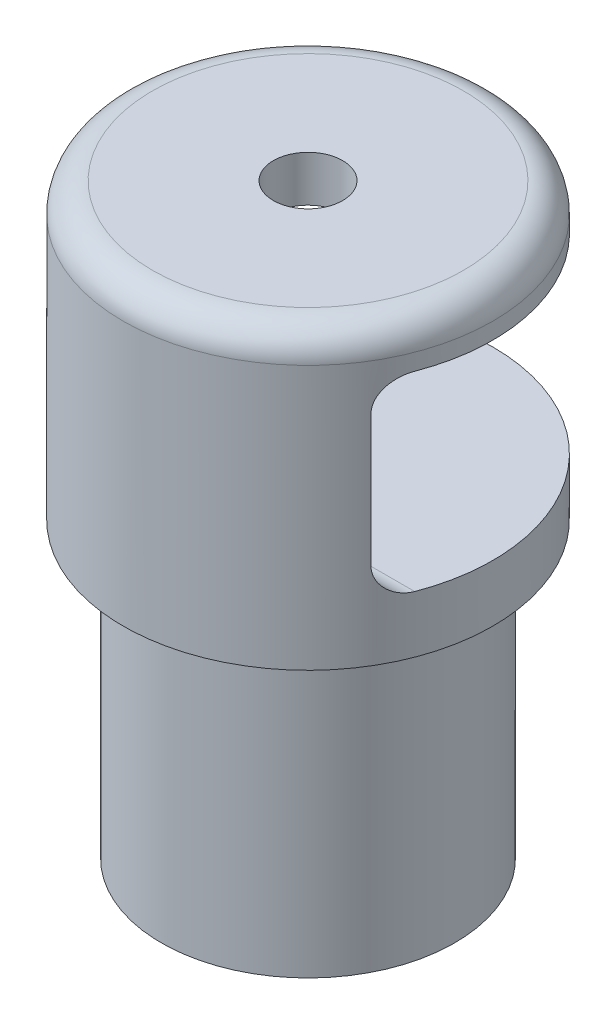
ISO-10303-21;
HEADER;
FILE_DESCRIPTION(('STEP AP214'),'2;1');
FILE_NAME('part.step','',(''),(''),'','','');
FILE_SCHEMA(('AUTOMOTIVE_DESIGN { 1 0 10303 214 1 1 1 1 }'));
ENDSEC;
DATA;
#1=APPLICATION_CONTEXT('core data for automotive mechanical design processes');
#2=APPLICATION_PROTOCOL_DEFINITION('international standard','automotive_design',2000,#1);
#3=PRODUCT_CONTEXT('',#1,'mechanical');
#4=PRODUCT('Part','Part','',(#3));
#5=PRODUCT_RELATED_PRODUCT_CATEGORY('part','',(#4));
#6=PRODUCT_DEFINITION_FORMATION('','',#4);
#7=PRODUCT_DEFINITION_CONTEXT('part definition',#1,'design');
#8=PRODUCT_DEFINITION('design','',#6,#7);
#9=PRODUCT_DEFINITION_SHAPE('','',#8);
#10=(LENGTH_UNIT() NAMED_UNIT(*) SI_UNIT(.MILLI.,.METRE.));
#11=(NAMED_UNIT(*) PLANE_ANGLE_UNIT() SI_UNIT($,.RADIAN.));
#12=(NAMED_UNIT(*) SI_UNIT($,.STERADIAN.) SOLID_ANGLE_UNIT());
#13=UNCERTAINTY_MEASURE_WITH_UNIT(LENGTH_MEASURE(1.E-05),#10,'distance_accuracy_value','');
#14=(GEOMETRIC_REPRESENTATION_CONTEXT(3) GLOBAL_UNCERTAINTY_ASSIGNED_CONTEXT((#13)) GLOBAL_UNIT_ASSIGNED_CONTEXT((#10,
#11,#12)) REPRESENTATION_CONTEXT('',''));
#15=CARTESIAN_POINT('',(0.,0.,0.));
#16=DIRECTION('',(0.,0.,1.));
#17=DIRECTION('',(1.,0.,0.));
#18=AXIS2_PLACEMENT_3D('',#15,#16,#17);
#19=CARTESIAN_POINT('',(0.,25.4,0.));
#20=DIRECTION('',(0.,-1.,0.));
#21=DIRECTION('',(0.,0.,-1.));
#22=AXIS2_PLACEMENT_3D('',#19,#20,#21);
#23=CYLINDRICAL_SURFACE('',#22,8.001);
#24=CARTESIAN_POINT('',(0.,24.13,0.));
#25=DIRECTION('',(0.,1.,0.));
#26=DIRECTION('',(0.,0.,1.));
#27=AXIS2_PLACEMENT_3D('',#24,#25,#26);
#28=CIRCLE('',#27,8.001);
#29=CARTESIAN_POINT('',(0.,24.13,8.001));
#30=VERTEX_POINT('',#29);
#31=EDGE_CURVE('E12',#30,#30,#28,.F.);
#32=ORIENTED_EDGE('',*,*,#31,.T.);
#33=EDGE_LOOP('',(#32));
#34=FACE_BOUND('',#33,.T.);
#35=CARTESIAN_POINT('',(0.,12.7,0.));
#36=DIRECTION('',(0.,-1.,0.));
#37=DIRECTION('',(0.,0.,-1.));
#38=AXIS2_PLACEMENT_3D('',#35,#36,#37);
#39=CIRCLE('',#38,8.001);
#40=CARTESIAN_POINT('',(0.,12.7,-8.001));
#41=VERTEX_POINT('',#40);
#42=EDGE_CURVE('E166',#41,#41,#39,.T.);
#43=ORIENTED_EDGE('',*,*,#42,.F.);
#44=EDGE_LOOP('',(#43));
#45=FACE_BOUND('',#44,.T.);
#46=DIRECTION('',(0.,-1.,0.));
#47=VECTOR('',#46,1.);
#48=CARTESIAN_POINT('',(6.85417717527057,25.4,4.1275));
#49=LINE('',#48,#47);
#50=CARTESIAN_POINT('',(6.85417717527057,22.1474266458921,4.1275));
#51=VERTEX_POINT('',#50);
#52=CARTESIAN_POINT('',(6.85417717527057,16.4324266458921,4.1275));
#53=VERTEX_POINT('',#52);
#54=EDGE_CURVE('E98',#51,#53,#49,.T.);
#55=ORIENTED_EDGE('',*,*,#54,.F.);
#56=CARTESIAN_POINT('',(6.85417717527057,22.1474266458921,4.1275));
#57=CARTESIAN_POINT('',(6.85417429884556,22.1798470518382,4.12750225335564));
#58=CARTESIAN_POINT('',(6.85492544327897,22.2122498815022,4.12625765111741));
#59=CARTESIAN_POINT('',(6.85790245854433,22.2767847183524,4.12130895610945));
#60=CARTESIAN_POINT('',(6.86012766901702,22.3089168402868,4.11760596465921));
#61=CARTESIAN_POINT('',(6.86893039923192,22.4042175790299,4.10291757081671));
#62=CARTESIAN_POINT('',(6.87763587088217,22.4666819283525,4.08835180226247));
#63=CARTESIAN_POINT('',(6.90004653430044,22.5877570395317,4.05041171354695));
#64=CARTESIAN_POINT('',(6.91374485232608,22.6463729692713,4.02704950215496));
#65=CARTESIAN_POINT('',(6.94524716607248,22.7586881959465,3.97247199781805));
#66=CARTESIAN_POINT('',(6.96305585155181,22.812381778164,3.9412477308657));
#67=CARTESIAN_POINT('',(7.00310213003201,22.9173040559657,3.86967037365722));
#68=CARTESIAN_POINT('',(7.02555646335208,22.9681268256126,3.8288459469888));
#69=CARTESIAN_POINT('',(7.07291797679626,23.0623834477106,3.74063372286644));
#70=CARTESIAN_POINT('',(7.0978261508631,23.1058142864264,3.6932432626169));
#71=CARTESIAN_POINT('',(7.15248233258746,23.1899528944106,3.58636967472194));
#72=CARTESIAN_POINT('',(7.18243592710045,23.2295504654812,3.52611587806907));
#73=CARTESIAN_POINT('',(7.24296524524495,23.2979406731036,3.40005225596353));
#74=CARTESIAN_POINT('',(7.2735410564545,23.3267317773822,3.33424164421687));
#75=CARTESIAN_POINT('',(7.33309185839614,23.3720136838401,3.20106934192217));
#76=CARTESIAN_POINT('',(7.36208385701293,23.3889256348783,3.13385860300669));
#77=CARTESIAN_POINT('',(7.41883513522172,23.4116397455985,2.99708241498394));
#78=CARTESIAN_POINT('',(7.44659431797212,23.417441034005,2.92751678164597));
#79=CARTESIAN_POINT('',(7.47333223870048,23.4174266458921,2.8575));
#80=B_SPLINE_CURVE_WITH_KNOTS('',3,(#56,#57,#58,#59,#60,#61,#62,#63,#64,#65,#66,#67,#68,#69,#70,
#71,#72,#73,#74,#75,#76,#77,#78,#79),.UNSPECIFIED.,.F.,.F.,(4,2,2,2,2,2,2,2,2,2,2,4),(0.,
0.0971947560388502,0.194345999718748,0.387490892143032,0.58037087669125,0.773472026782988,
0.979505916531334,1.18562360737006,1.41886176494324,1.65213298139756,1.87664789978313,
2.10118042344629),.UNSPECIFIED.);
#81=CARTESIAN_POINT('',(7.47333223870048,23.4174266458921,2.8575));
#82=VERTEX_POINT('',#81);
#83=EDGE_CURVE('E90',#51,#82,#80,.T.);
#84=ORIENTED_EDGE('',*,*,#83,.T.);
#85=CARTESIAN_POINT('',(0.,23.4174266458921,0.));
#86=DIRECTION('',(0.,-1.,0.));
#87=DIRECTION('',(0.,0.,-1.));
#88=AXIS2_PLACEMENT_3D('',#85,#86,#87);
#89=CIRCLE('',#88,8.001);
#90=CARTESIAN_POINT('',(-7.47333223870048,23.4174266458921,2.8575));
#91=VERTEX_POINT('',#90);
#92=EDGE_CURVE('E96',#91,#82,#89,.T.);
#93=ORIENTED_EDGE('',*,*,#92,.F.);
#94=CARTESIAN_POINT('',(-7.47333223870048,23.4174266458921,2.8575));
#95=CARTESIAN_POINT('',(-7.45847541982357,23.417425099579,2.89636075325786));
#96=CARTESIAN_POINT('',(-7.44332044203771,23.4156424137241,2.93508137181429));
#97=CARTESIAN_POINT('',(-7.41252836035214,23.408586073515,3.01199861443586));
#98=CARTESIAN_POINT('',(-7.3968913807876,23.403313312379,3.05019537002129));
#99=CARTESIAN_POINT('',(-7.34946348100169,23.3823859558764,3.16355307239509));
#100=CARTESIAN_POINT('',(-7.31711129396058,23.3616218518537,3.23759701562488));
#101=CARTESIAN_POINT('',(-7.25216394423312,23.3072317082288,3.38057667640805));
#102=CARTESIAN_POINT('',(-7.21956891180543,23.2736121367251,3.44951494204385));
#103=CARTESIAN_POINT('',(-7.15543871669103,23.1942465155436,3.58064577300952));
#104=CARTESIAN_POINT('',(-7.12390395435678,23.148495941941,3.64283580955418));
#105=CARTESIAN_POINT('',(-7.06334516474173,23.0454255784023,3.75891848185676));
#106=CARTESIAN_POINT('',(-7.03433481718968,22.9880477608441,3.81276701063749));
#107=CARTESIAN_POINT('',(-6.98090677503764,22.8629364810847,3.90973304640347));
#108=CARTESIAN_POINT('',(-6.95648708960734,22.7952075310648,3.95285520772174));
#109=CARTESIAN_POINT('',(-6.91625333256087,22.6576987355831,4.02280087955988));
#110=CARTESIAN_POINT('',(-6.89985946330156,22.588662616309,4.05074825189861));
#111=CARTESIAN_POINT('',(-6.87414537454121,22.4456289353831,4.0942376055976));
#112=CARTESIAN_POINT('',(-6.86480411962507,22.3716468501086,4.10981648495452));
#113=CARTESIAN_POINT('',(-6.85771095383446,22.2719728150129,4.12162673383259));
#114=CARTESIAN_POINT('',(-6.85638717132993,22.2471205230893,4.12382807078718));
#115=CARTESIAN_POINT('',(-6.8546212376712,22.1973258896554,4.12676296592364));
#116=CARTESIAN_POINT('',(-6.85417811148885,22.1723836783983,4.12749814737854));
#117=CARTESIAN_POINT('',(-6.85417717527057,22.1474266458921,4.1275));
#118=B_SPLINE_CURVE_WITH_KNOTS('',3,(#94,#95,#96,#97,#98,#99,#100,#101,#102,#103,#104,#105,#106,
#107,#108,#109,#110,#111,#112,#113,#114,#115,#116,#117),.UNSPECIFIED.,.F.,.F.,(4,2,2,2,2,2,2,2,
2,2,2,4),(0.,0.124726496325903,0.249421083625277,0.498443755433588,0.747341298514928,
0.996331791979455,1.24659694985154,1.49675332370686,1.72421112118749,1.95098778405803,
2.02589775101828,2.10072473429288),.UNSPECIFIED.);
#119=CARTESIAN_POINT('',(-6.85417717527057,22.1474266458921,4.1275));
#120=VERTEX_POINT('',#119);
#121=EDGE_CURVE('E82',#91,#120,#118,.T.);
#122=ORIENTED_EDGE('',*,*,#121,.T.);
#123=DIRECTION('',(0.,-1.,0.));
#124=VECTOR('',#123,1.);
#125=CARTESIAN_POINT('',(-6.85417717527057,25.4,4.1275));
#126=LINE('',#125,#124);
#127=CARTESIAN_POINT('',(-6.85417717527057,16.4324266458921,4.1275));
#128=VERTEX_POINT('',#127);
#129=EDGE_CURVE('E102',#128,#120,#126,.F.);
#130=ORIENTED_EDGE('',*,*,#129,.F.);
#131=CARTESIAN_POINT('',(-6.85417717527057,16.4324266458921,4.1275));
#132=CARTESIAN_POINT('',(-6.85417429884556,16.4000062399459,4.12750225335564));
#133=CARTESIAN_POINT('',(-6.85492544327897,16.3676034102819,4.12625765111742));
#134=CARTESIAN_POINT('',(-6.85790245854433,16.3030685734318,4.12130895610945));
#135=CARTESIAN_POINT('',(-6.86012766901702,16.2709364514974,4.11760596465921));
#136=CARTESIAN_POINT('',(-6.86893039923192,16.1756357127543,4.10291757081671));
#137=CARTESIAN_POINT('',(-6.87763587088217,16.1131713634317,4.08835180226247));
#138=CARTESIAN_POINT('',(-6.90004653430044,15.9920962522525,4.05041171354695));
#139=CARTESIAN_POINT('',(-6.91374485232608,15.9334803225128,4.02704950215496));
#140=CARTESIAN_POINT('',(-6.94524716607248,15.8211650958376,3.97247199781805));
#141=CARTESIAN_POINT('',(-6.96305585155181,15.7674715136201,3.9412477308657));
#142=CARTESIAN_POINT('',(-7.00310213003201,15.6625492358185,3.86967037365722));
#143=CARTESIAN_POINT('',(-7.02555646335208,15.6117264661715,3.8288459469888));
#144=CARTESIAN_POINT('',(-7.07291797679626,15.5174698440735,3.74063372286644));
#145=CARTESIAN_POINT('',(-7.0978261508631,15.4740390053577,3.69324326261689));
#146=CARTESIAN_POINT('',(-7.15248233258746,15.3899003973735,3.58636967472194));
#147=CARTESIAN_POINT('',(-7.18243592710045,15.3503028263029,3.52611587806907));
#148=CARTESIAN_POINT('',(-7.24296524524495,15.2819126186805,3.40005225596353));
#149=CARTESIAN_POINT('',(-7.2735410564545,15.2531215144019,3.33424164421687));
#150=CARTESIAN_POINT('',(-7.33309185839614,15.2078396079441,3.20106934192217));
#151=CARTESIAN_POINT('',(-7.36208385701293,15.1909276569058,3.13385860300669));
#152=CARTESIAN_POINT('',(-7.41883513522172,15.1682135461857,2.99708241498394));
#153=CARTESIAN_POINT('',(-7.44659431797213,15.1624122577791,2.92751678164597));
#154=CARTESIAN_POINT('',(-7.47333223870048,15.1624266458921,2.8575));
#155=B_SPLINE_CURVE_WITH_KNOTS('',3,(#131,#132,#133,#134,#135,#136,#137,#138,#139,#140,#141,
#142,#143,#144,#145,#146,#147,#148,#149,#150,#151,#152,#153,#154),.UNSPECIFIED.,.F.,.F.,(4,2,2,
2,2,2,2,2,2,2,2,4),(0.,0.0971947560388537,0.194345999718748,0.387490892143032,0.580370876691254,
0.773472026782988,0.979505916531334,1.18562360737006,1.41886176494325,1.65213298139757,
1.87664789978313,2.10118042344629),.UNSPECIFIED.);
#156=CARTESIAN_POINT('',(-7.47333223870048,15.1624266458921,2.8575));
#157=VERTEX_POINT('',#156);
#158=EDGE_CURVE('E53',#128,#157,#155,.T.);
#159=ORIENTED_EDGE('',*,*,#158,.T.);
#160=CARTESIAN_POINT('',(0.,15.1624266458921,0.));
#161=DIRECTION('',(0.,1.,0.));
#162=DIRECTION('',(0.,0.,1.));
#163=AXIS2_PLACEMENT_3D('',#160,#161,#162);
#164=CIRCLE('',#163,8.001);
#165=CARTESIAN_POINT('',(7.47333223870048,15.1624266458921,2.8575));
#166=VERTEX_POINT('',#165);
#167=EDGE_CURVE('E101',#166,#157,#164,.T.);
#168=ORIENTED_EDGE('',*,*,#167,.F.);
#169=CARTESIAN_POINT('',(7.47333223870048,15.1624266458921,2.8575));
#170=CARTESIAN_POINT('',(7.45847541982357,15.1624281922052,2.89636075325786));
#171=CARTESIAN_POINT('',(7.4433204420377,15.1642108780601,2.93508137181428));
#172=CARTESIAN_POINT('',(7.41252836035214,15.1712672182691,3.01199861443586));
#173=CARTESIAN_POINT('',(7.3968913807876,15.1765399794051,3.05019537002129));
#174=CARTESIAN_POINT('',(7.34946348100169,15.1974673359078,3.1635530723951));
#175=CARTESIAN_POINT('',(7.31711129396058,15.2182314399304,3.23759701562488));
#176=CARTESIAN_POINT('',(7.25216394423312,15.2726215835553,3.38057667640805));
#177=CARTESIAN_POINT('',(7.21956891180543,15.306241155059,3.44951494204386));
#178=CARTESIAN_POINT('',(7.15543871669103,15.3856067762405,3.58064577300952));
#179=CARTESIAN_POINT('',(7.12390395435678,15.4313573498431,3.64283580955418));
#180=CARTESIAN_POINT('',(7.06334516474173,15.5344277133818,3.75891848185676));
#181=CARTESIAN_POINT('',(7.03433481718968,15.59180553094,3.81276701063749));
#182=CARTESIAN_POINT('',(6.98090677503764,15.7169168106994,3.90973304640347));
#183=CARTESIAN_POINT('',(6.95648708960734,15.7846457607194,3.95285520772175));
#184=CARTESIAN_POINT('',(6.91625333256087,15.922154556201,4.02280087955988));
#185=CARTESIAN_POINT('',(6.89985946330156,15.9911906754751,4.05074825189862));
#186=CARTESIAN_POINT('',(6.87414537454121,16.134224356401,4.0942376055976));
#187=CARTESIAN_POINT('',(6.86480411962507,16.2082064416756,4.10981648495452));
#188=CARTESIAN_POINT('',(6.85771095383446,16.3078804767713,4.12162673383259));
#189=CARTESIAN_POINT('',(6.85638717132993,16.3327327686949,4.12382807078718));
#190=CARTESIAN_POINT('',(6.8546212376712,16.3825274021287,4.12676296592364));
#191=CARTESIAN_POINT('',(6.85417811148885,16.4074696133859,4.12749814737854));
#192=CARTESIAN_POINT('',(6.85417717527057,16.4324266458921,4.1275));
#193=B_SPLINE_CURVE_WITH_KNOTS('',3,(#169,#170,#171,#172,#173,#174,#175,#176,#177,#178,#179,
#180,#181,#182,#183,#184,#185,#186,#187,#188,#189,#190,#191,#192),.UNSPECIFIED.,.F.,.F.,(4,2,2,
2,2,2,2,2,2,2,2,4),(0.,0.124726496325903,0.249421083625276,0.498443755433589,0.74734129851493,
0.996331791979456,1.24659694985154,1.49675332370686,1.72421112118749,1.95098778405803,
2.02589775101827,2.10072473429288),.UNSPECIFIED.);
#194=EDGE_CURVE('E61',#166,#53,#193,.T.);
#195=ORIENTED_EDGE('',*,*,#194,.T.);
#196=EDGE_LOOP('',(#55,#84,#93,#122,#130,#159,#168,#195));
#197=FACE_BOUND('',#196,.T.);
#198=ADVANCED_FACE('F38',(#34,#45,#197),#23,.T.);
#199=CARTESIAN_POINT('',(0.,0.,0.));
#200=DIRECTION('',(0.,1.,0.));
#201=DIRECTION('',(0.,0.,1.));
#202=AXIS2_PLACEMENT_3D('',#199,#200,#201);
#203=PLANE('',#202);
#204=CARTESIAN_POINT('',(0.,0.,0.));
#205=DIRECTION('',(0.,-1.,0.));
#206=DIRECTION('',(0.,0.,-1.));
#207=AXIS2_PLACEMENT_3D('',#204,#205,#206);
#208=CIRCLE('',#207,4.699);
#209=CARTESIAN_POINT('',(0.,0.,-4.699));
#210=VERTEX_POINT('',#209);
#211=EDGE_CURVE('E168',#210,#210,#208,.T.);
#212=ORIENTED_EDGE('',*,*,#211,.F.);
#213=EDGE_LOOP('',(#212));
#214=FACE_BOUND('',#213,.T.);
#215=CARTESIAN_POINT('',(0.,0.,0.));
#216=DIRECTION('',(0.,-1.,0.));
#217=DIRECTION('',(0.,0.,-1.));
#218=AXIS2_PLACEMENT_3D('',#215,#216,#217);
#219=CIRCLE('',#218,6.35);
#220=CARTESIAN_POINT('',(0.,0.,-6.35));
#221=VERTEX_POINT('',#220);
#222=EDGE_CURVE('E173',#221,#221,#219,.T.);
#223=ORIENTED_EDGE('',*,*,#222,.T.);
#224=EDGE_LOOP('',(#223));
#225=FACE_BOUND('',#224,.T.);
#226=ADVANCED_FACE('F156',(#214,#225),#203,.F.);
#227=CARTESIAN_POINT('',(0.,12.7,0.));
#228=DIRECTION('',(0.,-1.,0.));
#229=DIRECTION('',(0.,0.,-1.));
#230=AXIS2_PLACEMENT_3D('',#227,#228,#229);
#231=CYLINDRICAL_SURFACE('',#230,4.699);
#232=CARTESIAN_POINT('',(0.,12.7,0.));
#233=DIRECTION('',(0.,-1.,0.));
#234=DIRECTION('',(0.,0.,-1.));
#235=AXIS2_PLACEMENT_3D('',#232,#233,#234);
#236=CIRCLE('',#235,4.699);
#237=CARTESIAN_POINT('',(0.,12.7,-4.699));
#238=VERTEX_POINT('',#237);
#239=EDGE_CURVE('E105',#238,#238,#236,.T.);
#240=ORIENTED_EDGE('',*,*,#239,.F.);
#241=EDGE_LOOP('',(#240));
#242=FACE_BOUND('',#241,.T.);
#243=ORIENTED_EDGE('',*,*,#211,.T.);
#244=EDGE_LOOP('',(#243));
#245=FACE_BOUND('',#244,.T.);
#246=ADVANCED_FACE('F161',(#242,#245),#231,.F.);
#247=CARTESIAN_POINT('',(0.,12.7,0.));
#248=DIRECTION('',(0.,-1.,0.));
#249=DIRECTION('',(0.,0.,-1.));
#250=AXIS2_PLACEMENT_3D('',#247,#248,#249);
#251=PLANE('',#250);
#252=CARTESIAN_POINT('',(0.,12.7,0.));
#253=DIRECTION('',(0.,-1.,0.));
#254=DIRECTION('',(0.,0.,-1.));
#255=AXIS2_PLACEMENT_3D('',#252,#253,#254);
#256=CIRCLE('',#255,1.25);
#257=CARTESIAN_POINT('',(0.,12.7,-1.25));
#258=VERTEX_POINT('',#257);
#259=EDGE_CURVE('E238',#258,#258,#256,.F.);
#260=ORIENTED_EDGE('',*,*,#259,.T.);
#261=EDGE_LOOP('',(#260));
#262=FACE_BOUND('',#261,.T.);
#263=ORIENTED_EDGE('',*,*,#239,.T.);
#264=EDGE_LOOP('',(#263));
#265=FACE_BOUND('',#264,.T.);
#266=ADVANCED_FACE('F183',(#262,#265),#251,.T.);
#267=CARTESIAN_POINT('',(0.,12.7,0.));
#268=DIRECTION('',(0.,-1.,0.));
#269=DIRECTION('',(0.,0.,-1.));
#270=AXIS2_PLACEMENT_3D('',#267,#268,#269);
#271=CYLINDRICAL_SURFACE('',#270,6.35);
#272=CARTESIAN_POINT('',(0.,12.7,0.));
#273=DIRECTION('',(0.,-1.,0.));
#274=DIRECTION('',(0.,0.,-1.));
#275=AXIS2_PLACEMENT_3D('',#272,#273,#274);
#276=CIRCLE('',#275,6.35);
#277=CARTESIAN_POINT('',(0.,12.7,-6.35));
#278=VERTEX_POINT('',#277);
#279=EDGE_CURVE('E169',#278,#278,#276,.T.);
#280=ORIENTED_EDGE('',*,*,#279,.T.);
#281=EDGE_LOOP('',(#280));
#282=FACE_BOUND('',#281,.T.);
#283=ORIENTED_EDGE('',*,*,#222,.F.);
#284=EDGE_LOOP('',(#283));
#285=FACE_BOUND('',#284,.T.);
#286=ADVANCED_FACE('F192',(#282,#285),#271,.T.);
#287=CARTESIAN_POINT('',(0.,12.7,0.));
#288=DIRECTION('',(0.,-1.,0.));
#289=DIRECTION('',(0.,0.,-1.));
#290=AXIS2_PLACEMENT_3D('',#287,#288,#289);
#291=PLANE('',#290);
#292=ORIENTED_EDGE('',*,*,#279,.F.);
#293=EDGE_LOOP('',(#292));
#294=FACE_BOUND('',#293,.T.);
#295=ORIENTED_EDGE('',*,*,#42,.T.);
#296=EDGE_LOOP('',(#295));
#297=FACE_BOUND('',#296,.T.);
#298=ADVANCED_FACE('F194',(#294,#297),#291,.T.);
#299=CARTESIAN_POINT('',(0.,25.4,0.));
#300=DIRECTION('',(0.,1.,0.));
#301=DIRECTION('',(0.,0.,1.));
#302=AXIS2_PLACEMENT_3D('',#299,#300,#301);
#303=PLANE('',#302);
#304=CARTESIAN_POINT('',(0.,25.4,0.));
#305=DIRECTION('',(0.,1.,0.));
#306=DIRECTION('',(0.,0.,1.));
#307=AXIS2_PLACEMENT_3D('',#304,#305,#306);
#308=CIRCLE('',#307,6.731);
#309=CARTESIAN_POINT('',(0.,25.4,6.731));
#310=VERTEX_POINT('',#309);
#311=EDGE_CURVE('E46',#310,#310,#308,.T.);
#312=ORIENTED_EDGE('',*,*,#311,.T.);
#313=EDGE_LOOP('',(#312));
#314=FACE_BOUND('',#313,.T.);
#315=CARTESIAN_POINT('',(0.,25.4,0.));
#316=DIRECTION('',(0.,1.,0.));
#317=DIRECTION('',(0.,0.,1.));
#318=AXIS2_PLACEMENT_3D('',#315,#316,#317);
#319=CIRCLE('',#318,1.5);
#320=CARTESIAN_POINT('',(0.,25.4,1.5));
#321=VERTEX_POINT('',#320);
#322=EDGE_CURVE('E179',#321,#321,#319,.T.);
#323=ORIENTED_EDGE('',*,*,#322,.F.);
#324=EDGE_LOOP('',(#323));
#325=FACE_BOUND('',#324,.T.);
#326=ADVANCED_FACE('F143',(#314,#325),#303,.T.);
#327=CARTESIAN_POINT('',(-10.164689161229,15.1624266458921,4.1275));
#328=DIRECTION('',(0.,1.,0.));
#329=DIRECTION('',(0.,0.,1.));
#330=AXIS2_PLACEMENT_3D('',#327,#328,#329);
#331=PLANE('',#330);
#332=CARTESIAN_POINT('',(0.,15.1624266458921,0.));
#333=DIRECTION('',(0.,1.,0.));
#334=DIRECTION('',(0.,0.,1.));
#335=AXIS2_PLACEMENT_3D('',#332,#333,#334);
#336=CIRCLE('',#335,1.25);
#337=CARTESIAN_POINT('',(0.,15.1624266458921,1.25));
#338=VERTEX_POINT('',#337);
#339=EDGE_CURVE('E236',#338,#338,#336,.T.);
#340=ORIENTED_EDGE('',*,*,#339,.F.);
#341=EDGE_LOOP('',(#340));
#342=FACE_BOUND('',#341,.T.);
#343=ORIENTED_EDGE('',*,*,#167,.T.);
#344=DIRECTION('',(1.,0.,0.));
#345=VECTOR('',#344,1.);
#346=CARTESIAN_POINT('',(6.85417717527057,15.1624266458921,2.8575));
#347=LINE('',#346,#345);
#348=EDGE_CURVE('E91',#157,#166,#347,.T.);
#349=ORIENTED_EDGE('',*,*,#348,.T.);
#350=EDGE_LOOP('',(#343,#349));
#351=FACE_BOUND('',#350,.T.);
#352=ADVANCED_FACE('F208',(#342,#351),#331,.T.);
#353=CARTESIAN_POINT('',(-10.164689161229,23.4174266458921,4.1275));
#354=DIRECTION('',(0.,-1.,0.));
#355=DIRECTION('',(0.,0.,-1.));
#356=AXIS2_PLACEMENT_3D('',#353,#354,#355);
#357=PLANE('',#356);
#358=CARTESIAN_POINT('',(0.,23.4174266458921,0.));
#359=DIRECTION('',(0.,-1.,0.));
#360=DIRECTION('',(0.,0.,-1.));
#361=AXIS2_PLACEMENT_3D('',#358,#359,#360);
#362=CIRCLE('',#361,1.5);
#363=CARTESIAN_POINT('',(0.,23.4174266458921,1.5));
#364=VERTEX_POINT('',#363);
#365=EDGE_CURVE('E232',#364,#364,#362,.F.);
#366=ORIENTED_EDGE('',*,*,#365,.T.);
#367=EDGE_LOOP('',(#366));
#368=FACE_BOUND('',#367,.T.);
#369=ORIENTED_EDGE('',*,*,#92,.T.);
#370=DIRECTION('',(-1.,0.,0.));
#371=VECTOR('',#370,1.);
#372=CARTESIAN_POINT('',(-6.85417717527057,23.4174266458921,2.8575));
#373=LINE('',#372,#371);
#374=EDGE_CURVE('E86',#82,#91,#373,.T.);
#375=ORIENTED_EDGE('',*,*,#374,.T.);
#376=EDGE_LOOP('',(#369,#375));
#377=FACE_BOUND('',#376,.T.);
#378=ADVANCED_FACE('F95',(#368,#377),#357,.T.);
#379=CARTESIAN_POINT('',(0.,0.,4.1275));
#380=DIRECTION('',(0.,0.,-1.));
#381=DIRECTION('',(-1.,0.,0.));
#382=AXIS2_PLACEMENT_3D('',#379,#380,#381);
#383=PLANE('',#382);
#384=ORIENTED_EDGE('',*,*,#129,.T.);
#385=DIRECTION('',(-1.,0.,0.));
#386=VECTOR('',#385,1.);
#387=CARTESIAN_POINT('',(6.85417717527057,22.1474266458921,4.1275));
#388=LINE('',#387,#386);
#389=EDGE_CURVE('E87',#120,#51,#388,.F.);
#390=ORIENTED_EDGE('',*,*,#389,.T.);
#391=ORIENTED_EDGE('',*,*,#54,.T.);
#392=DIRECTION('',(1.,0.,0.));
#393=VECTOR('',#392,1.);
#394=CARTESIAN_POINT('',(-6.85417717527057,16.4324266458921,4.1275));
#395=LINE('',#394,#393);
#396=EDGE_CURVE('E97',#53,#128,#395,.F.);
#397=ORIENTED_EDGE('',*,*,#396,.T.);
#398=EDGE_LOOP('',(#384,#390,#391,#397));
#399=FACE_BOUND('',#398,.T.);
#400=ADVANCED_FACE('F216',(#399),#383,.T.);
#401=CARTESIAN_POINT('',(0.,-0.001000000000001,0.));
#402=DIRECTION('',(0.,1.,0.));
#403=DIRECTION('',(0.,0.,1.));
#404=AXIS2_PLACEMENT_3D('',#401,#402,#403);
#405=CYLINDRICAL_SURFACE('',#404,1.5);
#406=CARTESIAN_POINT('',(0.,23.4174266458921,1.5));
#407=CARTESIAN_POINT('',(0.,23.438078451664,1.5));
#408=CARTESIAN_POINT('',(0.,23.458730257436,1.5));
#409=CARTESIAN_POINT('',(0.,23.5000338689799,1.5));
#410=CARTESIAN_POINT('',(0.,23.5206856747519,1.5));
#411=CARTESIAN_POINT('',(0.,23.5619892862958,1.5));
#412=CARTESIAN_POINT('',(0.,23.5826410920677,1.5));
#413=CARTESIAN_POINT('',(0.,23.6239447036116,1.5));
#414=CARTESIAN_POINT('',(0.,23.6445965093836,1.5));
#415=CARTESIAN_POINT('',(0.,23.6859001209275,1.5));
#416=CARTESIAN_POINT('',(0.,23.7065519266995,1.5));
#417=CARTESIAN_POINT('',(0.,23.7478555382434,1.5));
#418=CARTESIAN_POINT('',(0.,23.7685073440153,1.5));
#419=CARTESIAN_POINT('',(0.,23.8098109555593,1.5));
#420=CARTESIAN_POINT('',(0.,23.8304627613312,1.5));
#421=CARTESIAN_POINT('',(0.,23.8717663728751,1.5));
#422=CARTESIAN_POINT('',(0.,23.8924181786471,1.5));
#423=CARTESIAN_POINT('',(0.,23.933721790191,1.5));
#424=CARTESIAN_POINT('',(0.,23.954373595963,1.5));
#425=CARTESIAN_POINT('',(0.,23.9956772075069,1.5));
#426=CARTESIAN_POINT('',(0.,24.0163290132788,1.5));
#427=CARTESIAN_POINT('',(0.,24.0576326248228,1.5));
#428=CARTESIAN_POINT('',(0.,24.0782844305947,1.5));
#429=CARTESIAN_POINT('',(0.,24.1195880421386,1.5));
#430=CARTESIAN_POINT('',(0.,24.1402398479106,1.5));
#431=CARTESIAN_POINT('',(0.,24.1815434594545,1.5));
#432=CARTESIAN_POINT('',(0.,24.2021952652265,1.5));
#433=CARTESIAN_POINT('',(0.,24.2434988767704,1.5));
#434=CARTESIAN_POINT('',(0.,24.2641506825423,1.5));
#435=CARTESIAN_POINT('',(0.,24.3054542940862,1.5));
#436=CARTESIAN_POINT('',(0.,24.3261060998582,1.5));
#437=CARTESIAN_POINT('',(0.,24.3674097114021,1.5));
#438=CARTESIAN_POINT('',(0.,24.3880615171741,1.5));
#439=CARTESIAN_POINT('',(0.,24.429365128718,1.5));
#440=CARTESIAN_POINT('',(0.,24.4500169344899,1.5));
#441=CARTESIAN_POINT('',(0.,24.4913205460339,1.5));
#442=CARTESIAN_POINT('',(0.,24.5119723518058,1.5));
#443=CARTESIAN_POINT('',(0.,24.5532759633497,1.5));
#444=CARTESIAN_POINT('',(0.,24.5739277691217,1.5));
#445=CARTESIAN_POINT('',(0.,24.6152313806656,1.5));
#446=CARTESIAN_POINT('',(0.,24.6358831864376,1.5));
#447=CARTESIAN_POINT('',(0.,24.6771867979815,1.5));
#448=CARTESIAN_POINT('',(0.,24.6978386037534,1.5));
#449=CARTESIAN_POINT('',(0.,24.7391422152974,1.5));
#450=CARTESIAN_POINT('',(0.,24.7597940210693,1.5));
#451=CARTESIAN_POINT('',(0.,24.8010976326132,1.5));
#452=CARTESIAN_POINT('',(0.,24.8217494383852,1.5));
#453=CARTESIAN_POINT('',(0.,24.8630530499291,1.5));
#454=CARTESIAN_POINT('',(0.,24.8837048557011,1.5));
#455=CARTESIAN_POINT('',(0.,24.925008467245,1.5));
#456=CARTESIAN_POINT('',(0.,24.9456602730169,1.5));
#457=CARTESIAN_POINT('',(0.,24.9869638845608,1.5));
#458=CARTESIAN_POINT('',(0.,25.0076156903328,1.5));
#459=CARTESIAN_POINT('',(0.,25.0489193018767,1.5));
#460=CARTESIAN_POINT('',(0.,25.0695711076487,1.5));
#461=CARTESIAN_POINT('',(0.,25.1108747191926,1.5));
#462=CARTESIAN_POINT('',(0.,25.1315265249645,1.5));
#463=CARTESIAN_POINT('',(0.,25.1728301365085,1.5));
#464=CARTESIAN_POINT('',(0.,25.1934819422804,1.5));
#465=CARTESIAN_POINT('',(0.,25.2347855538243,1.5));
#466=CARTESIAN_POINT('',(0.,25.2554373595963,1.5));
#467=CARTESIAN_POINT('',(0.,25.2967409711402,1.5));
#468=CARTESIAN_POINT('',(0.,25.3173927769122,1.5));
#469=CARTESIAN_POINT('',(0.,25.3586963884561,1.5));
#470=CARTESIAN_POINT('',(0.,25.379348194228,1.5));
#471=CARTESIAN_POINT('',(0.,25.4,1.5));
#472=B_SPLINE_CURVE_WITH_KNOTS('',3,(#406,#407,#408,#409,#410,#411,#412,#413,#414,#415,#416,
#417,#418,#419,#420,#421,#422,#423,#424,#425,#426,#427,#428,#429,#430,#431,#432,#433,#434,#435,
#436,#437,#438,#439,#440,#441,#442,#443,#444,#445,#446,#447,#448,#449,#450,#451,#452,#453,#454,
#455,#456,#457,#458,#459,#460,#461,#462,#463,#464,#465,#466,#467,#468,#469,#470,#471),
.UNSPECIFIED.,.F.,.F.,(4,2,2,2,2,2,2,2,2,2,2,2,2,2,2,2,2,2,2,2,2,2,2,2,2,2,2,2,2,2,2,2,4),(0.,
0.0619554173158718,0.123910834631744,0.185866251947619,0.247821669263491,0.309777086579362,
0.371732503895238,0.433687921211109,0.495643338526981,0.557598755842853,0.619554173158725,
0.6815095904746,0.743465007790472,0.805420425106344,0.867375842422219,0.929331259738091,
0.991286677053962,1.05324209436983,1.11519751168571,1.17715292900158,1.23910834631745,
1.30106376363332,1.3630191809492,1.42497459826507,1.48693001558094,1.54888543289682,
1.61084085021269,1.67279626752856,1.73475168484443,1.79670710216031,1.85866251947618,
1.92061793679205,1.98257335410792),.UNSPECIFIED.);
#473=EDGE_CURVE('BSEAM128',#364,#321,#472,.T.);
#474=ORIENTED_EDGE('',*,*,#365,.F.);
#475=ORIENTED_EDGE('',*,*,#322,.T.);
#476=ORIENTED_EDGE('',*,*,#473,.T.);
#477=ORIENTED_EDGE('',*,*,#473,.F.);
#478=EDGE_LOOP('',(#474,#476,#475,#477));
#479=FACE_BOUND('',#478,.T.);
#480=ADVANCED_FACE('F128',(#479),#405,.F.);
#481=CARTESIAN_POINT('',(-10.164689161229,22.1474266458921,2.8575));
#482=DIRECTION('',(1.,0.,0.));
#483=DIRECTION('',(0.,0.,-1.));
#484=AXIS2_PLACEMENT_3D('',#481,#482,#483);
#485=CYLINDRICAL_SURFACE('',#484,1.27);
#486=ORIENTED_EDGE('',*,*,#83,.F.);
#487=ORIENTED_EDGE('',*,*,#389,.F.);
#488=ORIENTED_EDGE('',*,*,#121,.F.);
#489=ORIENTED_EDGE('',*,*,#374,.F.);
#490=EDGE_LOOP('',(#486,#487,#488,#489));
#491=FACE_BOUND('',#490,.T.);
#492=ADVANCED_FACE('F85',(#491),#485,.F.);
#493=CARTESIAN_POINT('',(-10.164689161229,16.4324266458921,2.8575));
#494=DIRECTION('',(-1.,0.,0.));
#495=DIRECTION('',(0.,0.,1.));
#496=AXIS2_PLACEMENT_3D('',#493,#494,#495);
#497=CYLINDRICAL_SURFACE('',#496,1.27);
#498=ORIENTED_EDGE('',*,*,#158,.F.);
#499=ORIENTED_EDGE('',*,*,#396,.F.);
#500=ORIENTED_EDGE('',*,*,#194,.F.);
#501=ORIENTED_EDGE('',*,*,#348,.F.);
#502=EDGE_LOOP('',(#498,#499,#500,#501));
#503=FACE_BOUND('',#502,.T.);
#504=ADVANCED_FACE('F127',(#503),#497,.F.);
#505=CARTESIAN_POINT('',(0.,24.13,0.));
#506=DIRECTION('',(0.,1.,0.));
#507=DIRECTION('',(0.,0.,1.));
#508=AXIS2_PLACEMENT_3D('',#505,#506,#507);
#509=TOROIDAL_SURFACE('',#508,6.731,1.27);
#510=ORIENTED_EDGE('',*,*,#31,.F.);
#511=EDGE_LOOP('',(#510));
#512=FACE_BOUND('',#511,.T.);
#513=ORIENTED_EDGE('',*,*,#311,.F.);
#514=EDGE_LOOP('',(#513));
#515=FACE_BOUND('',#514,.T.);
#516=ADVANCED_FACE('F40',(#512,#515),#509,.T.);
#517=CARTESIAN_POINT('',(0.,-0.000999999999999265,0.));
#518=DIRECTION('',(0.,1.,0.));
#519=DIRECTION('',(0.,0.,1.));
#520=AXIS2_PLACEMENT_3D('',#517,#518,#519);
#521=CYLINDRICAL_SURFACE('',#520,1.25);
#522=ORIENTED_EDGE('',*,*,#259,.F.);
#523=EDGE_LOOP('',(#522));
#524=FACE_BOUND('',#523,.T.);
#525=ORIENTED_EDGE('',*,*,#339,.T.);
#526=EDGE_LOOP('',(#525));
#527=FACE_BOUND('',#526,.T.);
#528=ADVANCED_FACE('F147',(#524,#527),#521,.F.);
#529=CLOSED_SHELL('',(#198,#226,#246,#266,#286,#298,#326,#352,#378,#400,#480,#492,#504,#516,#528));
#530=MANIFOLD_SOLID_BREP('B2',#529);
#531=ADVANCED_BREP_SHAPE_REPRESENTATION('',(#18,#530),#14);
#532=SHAPE_DEFINITION_REPRESENTATION(#9,#531);
ENDSEC;
END-ISO-10303-21;
